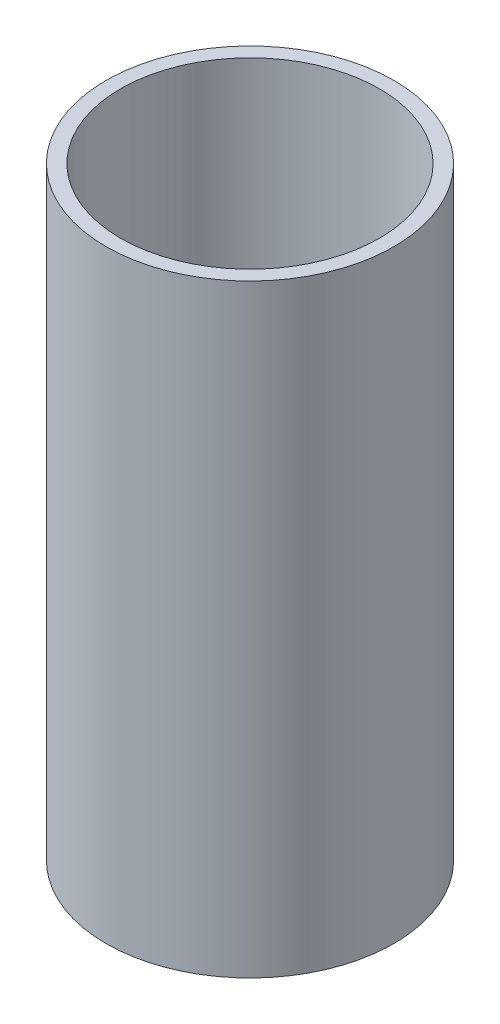
ISO-10303-21;
HEADER;
FILE_DESCRIPTION(('STEP AP214'),'2;1');
FILE_NAME('part.step','',(''),(''),'','','');
FILE_SCHEMA(('AUTOMOTIVE_DESIGN { 1 0 10303 214 1 1 1 1 }'));
ENDSEC;
DATA;
#1=APPLICATION_CONTEXT('core data for automotive mechanical design processes');
#2=APPLICATION_PROTOCOL_DEFINITION('international standard','automotive_design',2000,#1);
#3=PRODUCT_CONTEXT('',#1,'mechanical');
#4=PRODUCT('Part','Part','',(#3));
#5=PRODUCT_RELATED_PRODUCT_CATEGORY('part','',(#4));
#6=PRODUCT_DEFINITION_FORMATION('','',#4);
#7=PRODUCT_DEFINITION_CONTEXT('part definition',#1,'design');
#8=PRODUCT_DEFINITION('design','',#6,#7);
#9=PRODUCT_DEFINITION_SHAPE('','',#8);
#10=(LENGTH_UNIT() NAMED_UNIT(*) SI_UNIT(.MILLI.,.METRE.));
#11=(NAMED_UNIT(*) PLANE_ANGLE_UNIT() SI_UNIT($,.RADIAN.));
#12=(NAMED_UNIT(*) SI_UNIT($,.STERADIAN.) SOLID_ANGLE_UNIT());
#13=UNCERTAINTY_MEASURE_WITH_UNIT(LENGTH_MEASURE(1.E-05),#10,'distance_accuracy_value','');
#14=(GEOMETRIC_REPRESENTATION_CONTEXT(3) GLOBAL_UNCERTAINTY_ASSIGNED_CONTEXT((#13)) GLOBAL_UNIT_ASSIGNED_CONTEXT((#10,
#11,#12)) REPRESENTATION_CONTEXT('',''));
#15=CARTESIAN_POINT('',(0.,0.,0.));
#16=DIRECTION('',(0.,0.,1.));
#17=DIRECTION('',(1.,0.,0.));
#18=AXIS2_PLACEMENT_3D('',#15,#16,#17);
#19=CARTESIAN_POINT('',(0.,50.,0.));
#20=DIRECTION('',(0.,-1.,0.));
#21=DIRECTION('',(0.,0.,-1.));
#22=AXIS2_PLACEMENT_3D('',#19,#20,#21);
#23=CYLINDRICAL_SURFACE('',#22,9.525);
#24=CARTESIAN_POINT('',(0.,20.,0.));
#25=DIRECTION('',(0.,-1.,0.));
#26=DIRECTION('',(0.,0.,-1.));
#27=AXIS2_PLACEMENT_3D('',#24,#25,#26);
#28=CIRCLE('',#27,9.525);
#29=CARTESIAN_POINT('',(0.,20.,-9.525));
#30=VERTEX_POINT('',#29);
#31=EDGE_CURVE('E51',#30,#30,#28,.T.);
#32=ORIENTED_EDGE('',*,*,#31,.T.);
#33=EDGE_LOOP('',(#32));
#34=FACE_BOUND('',#33,.T.);
#35=CARTESIAN_POINT('',(0.,30.,0.));
#36=DIRECTION('',(0.,1.,0.));
#37=DIRECTION('',(0.,0.,1.));
#38=AXIS2_PLACEMENT_3D('',#35,#36,#37);
#39=CIRCLE('',#38,9.525);
#40=CARTESIAN_POINT('',(0.,30.,9.525));
#41=VERTEX_POINT('',#40);
#42=EDGE_CURVE('E40',#41,#41,#39,.T.);
#43=ORIENTED_EDGE('',*,*,#42,.T.);
#44=EDGE_LOOP('',(#43));
#45=FACE_BOUND('',#44,.T.);
#46=ADVANCED_FACE('F36',(#34,#45),#23,.F.);
#47=CARTESIAN_POINT('',(0.,50.,0.));
#48=DIRECTION('',(0.,1.,0.));
#49=DIRECTION('',(0.,0.,1.));
#50=AXIS2_PLACEMENT_3D('',#47,#48,#49);
#51=PLANE('',#50);
#52=CARTESIAN_POINT('',(0.,50.,0.));
#53=DIRECTION('',(0.,1.,0.));
#54=DIRECTION('',(0.,0.,1.));
#55=AXIS2_PLACEMENT_3D('',#52,#53,#54);
#56=CIRCLE('',#55,10.7250000000001);
#57=CARTESIAN_POINT('',(0.,50.,10.7250000000001));
#58=VERTEX_POINT('',#57);
#59=EDGE_CURVE('E68',#58,#58,#56,.T.);
#60=ORIENTED_EDGE('',*,*,#59,.F.);
#61=EDGE_LOOP('',(#60));
#62=FACE_BOUND('',#61,.T.);
#63=CARTESIAN_POINT('',(0.,50.,0.));
#64=DIRECTION('',(0.,1.,0.));
#65=DIRECTION('',(0.,0.,1.));
#66=AXIS2_PLACEMENT_3D('',#63,#64,#65);
#67=CIRCLE('',#66,11.925);
#68=CARTESIAN_POINT('',(0.,50.,11.925));
#69=VERTEX_POINT('',#68);
#70=EDGE_CURVE('E10',#69,#69,#67,.T.);
#71=ORIENTED_EDGE('',*,*,#70,.T.);
#72=EDGE_LOOP('',(#71));
#73=FACE_BOUND('',#72,.T.);
#74=ADVANCED_FACE('F93',(#62,#73),#51,.T.);
#75=CARTESIAN_POINT('',(0.,0.,0.));
#76=DIRECTION('',(0.,1.,0.));
#77=DIRECTION('',(0.,0.,1.));
#78=AXIS2_PLACEMENT_3D('',#75,#76,#77);
#79=PLANE('',#78);
#80=CARTESIAN_POINT('',(0.,0.,0.));
#81=DIRECTION('',(0.,-1.,0.));
#82=DIRECTION('',(0.,0.,-1.));
#83=AXIS2_PLACEMENT_3D('',#80,#81,#82);
#84=CIRCLE('',#83,10.8);
#85=CARTESIAN_POINT('',(0.,0.,-10.8));
#86=VERTEX_POINT('',#85);
#87=EDGE_CURVE('E54',#86,#86,#84,.T.);
#88=ORIENTED_EDGE('',*,*,#87,.F.);
#89=EDGE_LOOP('',(#88));
#90=FACE_BOUND('',#89,.T.);
#91=CARTESIAN_POINT('',(0.,0.,0.));
#92=DIRECTION('',(0.,1.,0.));
#93=DIRECTION('',(0.,0.,1.));
#94=AXIS2_PLACEMENT_3D('',#91,#92,#93);
#95=CIRCLE('',#94,11.925);
#96=CARTESIAN_POINT('',(0.,0.,11.925));
#97=VERTEX_POINT('',#96);
#98=EDGE_CURVE('E45',#97,#97,#95,.T.);
#99=ORIENTED_EDGE('',*,*,#98,.F.);
#100=EDGE_LOOP('',(#99));
#101=FACE_BOUND('',#100,.T.);
#102=ADVANCED_FACE('F99',(#90,#101),#79,.F.);
#103=CARTESIAN_POINT('',(0.,50.,0.));
#104=DIRECTION('',(0.,-1.,0.));
#105=DIRECTION('',(0.,0.,-1.));
#106=AXIS2_PLACEMENT_3D('',#103,#104,#105);
#107=CYLINDRICAL_SURFACE('',#106,11.925);
#108=ORIENTED_EDGE('',*,*,#70,.F.);
#109=EDGE_LOOP('',(#108));
#110=FACE_BOUND('',#109,.T.);
#111=ORIENTED_EDGE('',*,*,#98,.T.);
#112=EDGE_LOOP('',(#111));
#113=FACE_BOUND('',#112,.T.);
#114=ADVANCED_FACE('F38',(#110,#113),#107,.T.);
#115=CARTESIAN_POINT('',(0.,20.,0.));
#116=DIRECTION('',(0.,-1.,0.));
#117=DIRECTION('',(0.,0.,-1.));
#118=AXIS2_PLACEMENT_3D('',#115,#116,#117);
#119=CYLINDRICAL_SURFACE('',#118,10.8);
#120=CARTESIAN_POINT('',(0.,20.,0.));
#121=DIRECTION('',(0.,-1.,0.));
#122=DIRECTION('',(0.,0.,-1.));
#123=AXIS2_PLACEMENT_3D('',#120,#121,#122);
#124=CIRCLE('',#123,10.8);
#125=CARTESIAN_POINT('',(0.,20.,-10.8));
#126=VERTEX_POINT('',#125);
#127=EDGE_CURVE('E58',#126,#126,#124,.T.);
#128=ORIENTED_EDGE('',*,*,#127,.F.);
#129=EDGE_LOOP('',(#128));
#130=FACE_BOUND('',#129,.T.);
#131=ORIENTED_EDGE('',*,*,#87,.T.);
#132=EDGE_LOOP('',(#131));
#133=FACE_BOUND('',#132,.T.);
#134=ADVANCED_FACE('F103',(#130,#133),#119,.F.);
#135=CARTESIAN_POINT('',(0.,20.,0.));
#136=DIRECTION('',(0.,-1.,0.));
#137=DIRECTION('',(0.,0.,-1.));
#138=AXIS2_PLACEMENT_3D('',#135,#136,#137);
#139=PLANE('',#138);
#140=ORIENTED_EDGE('',*,*,#31,.F.);
#141=EDGE_LOOP('',(#140));
#142=FACE_BOUND('',#141,.T.);
#143=ORIENTED_EDGE('',*,*,#127,.T.);
#144=EDGE_LOOP('',(#143));
#145=FACE_BOUND('',#144,.T.);
#146=ADVANCED_FACE('F89',(#142,#145),#139,.T.);
#147=CARTESIAN_POINT('',(0.,30.,0.));
#148=DIRECTION('',(0.,1.,0.));
#149=DIRECTION('',(0.,0.,1.));
#150=AXIS2_PLACEMENT_3D('',#147,#148,#149);
#151=CYLINDRICAL_SURFACE('',#150,10.7250000000001);
#152=CARTESIAN_POINT('',(0.,30.,0.));
#153=DIRECTION('',(0.,1.,0.));
#154=DIRECTION('',(0.,0.,1.));
#155=AXIS2_PLACEMENT_3D('',#152,#153,#154);
#156=CIRCLE('',#155,10.7250000000001);
#157=CARTESIAN_POINT('',(0.,30.,10.7250000000001));
#158=VERTEX_POINT('',#157);
#159=EDGE_CURVE('E72',#158,#158,#156,.T.);
#160=ORIENTED_EDGE('',*,*,#159,.F.);
#161=EDGE_LOOP('',(#160));
#162=FACE_BOUND('',#161,.T.);
#163=ORIENTED_EDGE('',*,*,#59,.T.);
#164=EDGE_LOOP('',(#163));
#165=FACE_BOUND('',#164,.T.);
#166=ADVANCED_FACE('F84',(#162,#165),#151,.F.);
#167=CARTESIAN_POINT('',(0.,30.,0.));
#168=DIRECTION('',(0.,1.,0.));
#169=DIRECTION('',(0.,0.,1.));
#170=AXIS2_PLACEMENT_3D('',#167,#168,#169);
#171=PLANE('',#170);
#172=ORIENTED_EDGE('',*,*,#42,.F.);
#173=EDGE_LOOP('',(#172));
#174=FACE_BOUND('',#173,.T.);
#175=ORIENTED_EDGE('',*,*,#159,.T.);
#176=EDGE_LOOP('',(#175));
#177=FACE_BOUND('',#176,.T.);
#178=ADVANCED_FACE('F82',(#174,#177),#171,.T.);
#179=CLOSED_SHELL('',(#46,#74,#102,#114,#134,#146,#166,#178));
#180=MANIFOLD_SOLID_BREP('B2',#179);
#181=ADVANCED_BREP_SHAPE_REPRESENTATION('',(#18,#180),#14);
#182=SHAPE_DEFINITION_REPRESENTATION(#9,#181);
ENDSEC;
END-ISO-10303-21;
